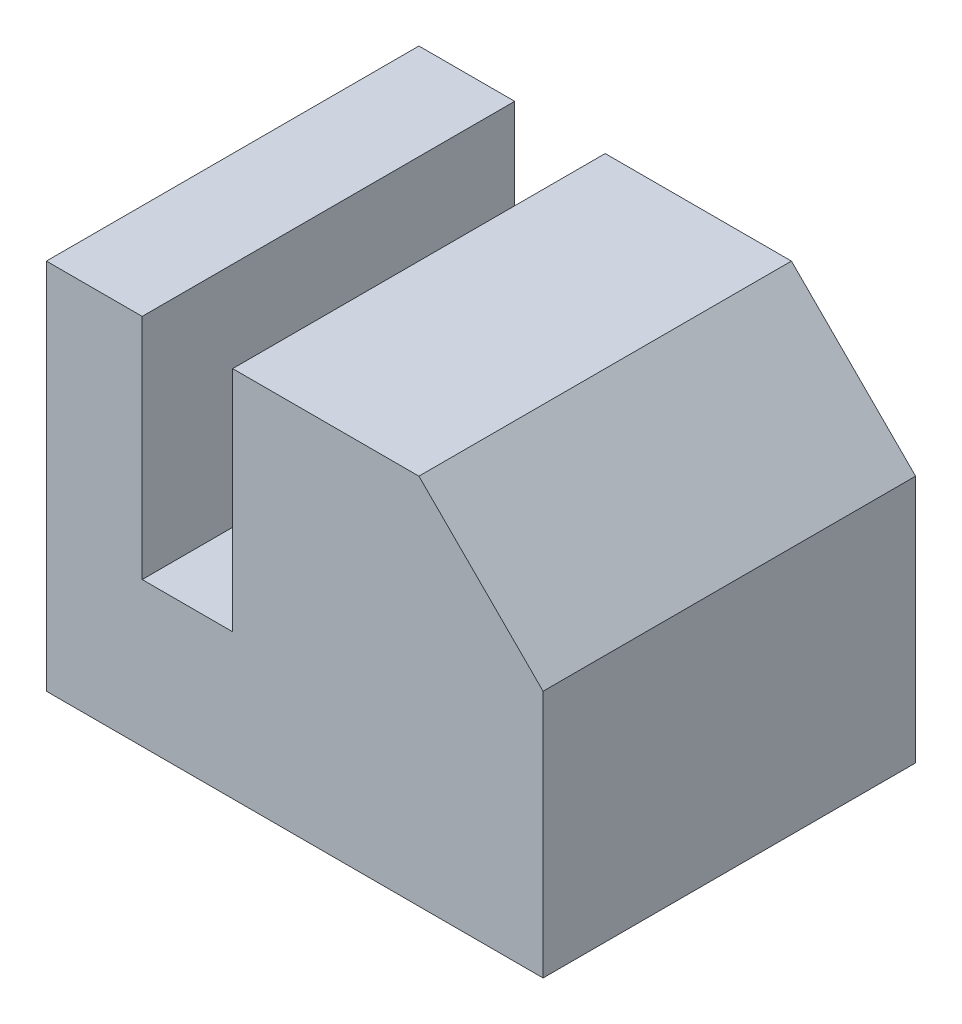
ISO-10303-21;
HEADER;
FILE_DESCRIPTION(('STEP AP214'),'2;1');
FILE_NAME('part.step','',(''),(''),'','','');
FILE_SCHEMA(('AUTOMOTIVE_DESIGN { 1 0 10303 214 1 1 1 1 }'));
ENDSEC;
DATA;
#1=APPLICATION_CONTEXT('core data for automotive mechanical design processes');
#2=APPLICATION_PROTOCOL_DEFINITION('international standard','automotive_design',2000,#1);
#3=PRODUCT_CONTEXT('',#1,'mechanical');
#4=PRODUCT('Part','Part','',(#3));
#5=PRODUCT_RELATED_PRODUCT_CATEGORY('part','',(#4));
#6=PRODUCT_DEFINITION_FORMATION('','',#4);
#7=PRODUCT_DEFINITION_CONTEXT('part definition',#1,'design');
#8=PRODUCT_DEFINITION('design','',#6,#7);
#9=PRODUCT_DEFINITION_SHAPE('','',#8);
#10=(LENGTH_UNIT() NAMED_UNIT(*) SI_UNIT(.MILLI.,.METRE.));
#11=(NAMED_UNIT(*) PLANE_ANGLE_UNIT() SI_UNIT($,.RADIAN.));
#12=(NAMED_UNIT(*) SI_UNIT($,.STERADIAN.) SOLID_ANGLE_UNIT());
#13=UNCERTAINTY_MEASURE_WITH_UNIT(LENGTH_MEASURE(1.E-05),#10,'distance_accuracy_value','');
#14=(GEOMETRIC_REPRESENTATION_CONTEXT(3) GLOBAL_UNCERTAINTY_ASSIGNED_CONTEXT((#13)) GLOBAL_UNIT_ASSIGNED_CONTEXT((#10,
#11,#12)) REPRESENTATION_CONTEXT('',''));
#15=CARTESIAN_POINT('',(0.,0.,0.));
#16=DIRECTION('',(0.,0.,1.));
#17=DIRECTION('',(1.,0.,0.));
#18=AXIS2_PLACEMENT_3D('',#15,#16,#17);
#19=CARTESIAN_POINT('',(-20.,15.,30.));
#20=DIRECTION('',(0.,-1.,0.));
#21=DIRECTION('',(0.,0.,-1.));
#22=AXIS2_PLACEMENT_3D('',#19,#20,#21);
#23=PLANE('',#22);
#24=DIRECTION('',(-1.,0.,0.));
#25=VECTOR('',#24,1.);
#26=CARTESIAN_POINT('',(-20.,15.,30.));
#27=LINE('',#26,#25);
#28=CARTESIAN_POINT('',(-12.2856365778249,15.,30.));
#29=VERTEX_POINT('',#28);
#30=CARTESIAN_POINT('',(-20.,15.,30.));
#31=VERTEX_POINT('',#30);
#32=EDGE_CURVE('E144',#29,#31,#27,.T.);
#33=ORIENTED_EDGE('',*,*,#32,.F.);
#34=DIRECTION('',(0.,0.,1.));
#35=VECTOR('',#34,1.);
#36=CARTESIAN_POINT('',(-12.2856365778249,15.,-19.7472700151907));
#37=LINE('',#36,#35);
#38=CARTESIAN_POINT('',(-12.2856365778249,15.,0.));
#39=VERTEX_POINT('',#38);
#40=EDGE_CURVE('E117',#39,#29,#37,.T.);
#41=ORIENTED_EDGE('',*,*,#40,.F.);
#42=DIRECTION('',(-1.,0.,0.));
#43=VECTOR('',#42,1.);
#44=CARTESIAN_POINT('',(-20.,15.,0.));
#45=LINE('',#44,#43);
#46=CARTESIAN_POINT('',(-20.,15.,0.));
#47=VERTEX_POINT('',#46);
#48=EDGE_CURVE('E155',#39,#47,#45,.T.);
#49=ORIENTED_EDGE('',*,*,#48,.T.);
#50=DIRECTION('',(0.,0.,-1.));
#51=VECTOR('',#50,1.);
#52=CARTESIAN_POINT('',(-20.,15.,30.));
#53=LINE('',#52,#51);
#54=EDGE_CURVE('E41',#31,#47,#53,.T.);
#55=ORIENTED_EDGE('',*,*,#54,.F.);
#56=EDGE_LOOP('',(#33,#41,#49,#55));
#57=FACE_BOUND('',#56,.T.);
#58=ADVANCED_FACE('F33',(#57),#23,.F.);
#59=CARTESIAN_POINT('',(20.,15.,30.));
#60=DIRECTION('',(-1.,0.,0.));
#61=DIRECTION('',(0.,-1.,0.));
#62=AXIS2_PLACEMENT_3D('',#59,#60,#61);
#63=PLANE('',#62);
#64=DIRECTION('',(0.,1.,0.));
#65=VECTOR('',#64,1.);
#66=CARTESIAN_POINT('',(20.,15.,0.));
#67=LINE('',#66,#65);
#68=CARTESIAN_POINT('',(20.,-15.,0.));
#69=VERTEX_POINT('',#68);
#70=CARTESIAN_POINT('',(20.,5.,0.));
#71=VERTEX_POINT('',#70);
#72=EDGE_CURVE('E139',#69,#71,#67,.T.);
#73=ORIENTED_EDGE('',*,*,#72,.T.);
#74=DIRECTION('',(0.,0.,1.));
#75=VECTOR('',#74,1.);
#76=CARTESIAN_POINT('',(20.,5.,-13.));
#77=LINE('',#76,#75);
#78=CARTESIAN_POINT('',(20.,5.,30.));
#79=VERTEX_POINT('',#78);
#80=EDGE_CURVE('E56',#71,#79,#77,.T.);
#81=ORIENTED_EDGE('',*,*,#80,.T.);
#82=DIRECTION('',(0.,1.,0.));
#83=VECTOR('',#82,1.);
#84=CARTESIAN_POINT('',(20.,15.,30.));
#85=LINE('',#84,#83);
#86=CARTESIAN_POINT('',(20.,-15.,30.));
#87=VERTEX_POINT('',#86);
#88=EDGE_CURVE('E141',#87,#79,#85,.T.);
#89=ORIENTED_EDGE('',*,*,#88,.F.);
#90=DIRECTION('',(0.,0.,-1.));
#91=VECTOR('',#90,1.);
#92=CARTESIAN_POINT('',(20.,-15.,30.));
#93=LINE('',#92,#91);
#94=EDGE_CURVE('E152',#87,#69,#93,.T.);
#95=ORIENTED_EDGE('',*,*,#94,.T.);
#96=EDGE_LOOP('',(#73,#81,#89,#95));
#97=FACE_BOUND('',#96,.T.);
#98=ADVANCED_FACE('F35',(#97),#63,.F.);
#99=CARTESIAN_POINT('',(10.,15.,0.));
#100=VERTEX_POINT('',#99);
#101=CARTESIAN_POINT('',(-5.,15.,0.));
#102=VERTEX_POINT('',#101);
#103=EDGE_CURVE('E156',#100,#102,#45,.T.);
#104=ORIENTED_EDGE('',*,*,#103,.T.);
#105=DIRECTION('',(0.,0.,1.));
#106=VECTOR('',#105,1.);
#107=CARTESIAN_POINT('',(-5.,15.,-19.7472700151907));
#108=LINE('',#107,#106);
#109=CARTESIAN_POINT('',(-5.,15.,30.));
#110=VERTEX_POINT('',#109);
#111=EDGE_CURVE('E129',#102,#110,#108,.T.);
#112=ORIENTED_EDGE('',*,*,#111,.T.);
#113=CARTESIAN_POINT('',(10.,15.,30.));
#114=VERTEX_POINT('',#113);
#115=EDGE_CURVE('E146',#114,#110,#27,.T.);
#116=ORIENTED_EDGE('',*,*,#115,.F.);
#117=DIRECTION('',(0.,0.,1.));
#118=VECTOR('',#117,1.);
#119=CARTESIAN_POINT('',(10.,15.,-13.));
#120=LINE('',#119,#118);
#121=EDGE_CURVE('E137',#100,#114,#120,.T.);
#122=ORIENTED_EDGE('',*,*,#121,.F.);
#123=EDGE_LOOP('',(#104,#112,#116,#122));
#124=FACE_BOUND('',#123,.T.);
#125=ADVANCED_FACE('F188',(#124),#23,.F.);
#126=CARTESIAN_POINT('',(-20.,15.,30.));
#127=DIRECTION('',(1.,0.,0.));
#128=DIRECTION('',(0.,0.,-1.));
#129=AXIS2_PLACEMENT_3D('',#126,#127,#128);
#130=PLANE('',#129);
#131=DIRECTION('',(0.,-1.,0.));
#132=VECTOR('',#131,1.);
#133=CARTESIAN_POINT('',(-20.,15.,0.));
#134=LINE('',#133,#132);
#135=CARTESIAN_POINT('',(-20.,-15.,0.));
#136=VERTEX_POINT('',#135);
#137=EDGE_CURVE('E159',#47,#136,#134,.T.);
#138=ORIENTED_EDGE('',*,*,#137,.T.);
#139=DIRECTION('',(0.,0.,-1.));
#140=VECTOR('',#139,1.);
#141=CARTESIAN_POINT('',(-20.,-15.,30.));
#142=LINE('',#141,#140);
#143=CARTESIAN_POINT('',(-20.,-15.,30.));
#144=VERTEX_POINT('',#143);
#145=EDGE_CURVE('E164',#144,#136,#142,.T.);
#146=ORIENTED_EDGE('',*,*,#145,.F.);
#147=DIRECTION('',(0.,-1.,0.));
#148=VECTOR('',#147,1.);
#149=CARTESIAN_POINT('',(-20.,15.,30.));
#150=LINE('',#149,#148);
#151=EDGE_CURVE('E148',#31,#144,#150,.T.);
#152=ORIENTED_EDGE('',*,*,#151,.F.);
#153=ORIENTED_EDGE('',*,*,#54,.T.);
#154=EDGE_LOOP('',(#138,#146,#152,#153));
#155=FACE_BOUND('',#154,.T.);
#156=ADVANCED_FACE('F171',(#155),#130,.F.);
#157=CARTESIAN_POINT('',(-20.,-15.,30.));
#158=DIRECTION('',(0.,1.,0.));
#159=DIRECTION('',(0.,0.,1.));
#160=AXIS2_PLACEMENT_3D('',#157,#158,#159);
#161=PLANE('',#160);
#162=DIRECTION('',(1.,0.,0.));
#163=VECTOR('',#162,1.);
#164=CARTESIAN_POINT('',(-20.,-15.,0.));
#165=LINE('',#164,#163);
#166=EDGE_CURVE('E145',#136,#69,#165,.T.);
#167=ORIENTED_EDGE('',*,*,#166,.T.);
#168=ORIENTED_EDGE('',*,*,#94,.F.);
#169=DIRECTION('',(1.,0.,0.));
#170=VECTOR('',#169,1.);
#171=CARTESIAN_POINT('',(-20.,-15.,30.));
#172=LINE('',#171,#170);
#173=EDGE_CURVE('E150',#144,#87,#172,.T.);
#174=ORIENTED_EDGE('',*,*,#173,.F.);
#175=ORIENTED_EDGE('',*,*,#145,.T.);
#176=EDGE_LOOP('',(#167,#168,#174,#175));
#177=FACE_BOUND('',#176,.T.);
#178=ADVANCED_FACE('F181',(#177),#161,.F.);
#179=CARTESIAN_POINT('',(0.,0.,30.));
#180=DIRECTION('',(0.,0.,1.));
#181=DIRECTION('',(1.,0.,0.));
#182=AXIS2_PLACEMENT_3D('',#179,#180,#181);
#183=PLANE('',#182);
#184=DIRECTION('',(0.,-1.,0.));
#185=VECTOR('',#184,1.);
#186=CARTESIAN_POINT('',(-12.2856365778249,15.,30.));
#187=LINE('',#186,#185);
#188=CARTESIAN_POINT('',(-12.2856365778249,-3.35413230606962,30.));
#189=VERTEX_POINT('',#188);
#190=EDGE_CURVE('E114',#29,#189,#187,.T.);
#191=ORIENTED_EDGE('',*,*,#190,.F.);
#192=ORIENTED_EDGE('',*,*,#32,.T.);
#193=ORIENTED_EDGE('',*,*,#151,.T.);
#194=ORIENTED_EDGE('',*,*,#173,.T.);
#195=ORIENTED_EDGE('',*,*,#88,.T.);
#196=DIRECTION('',(0.707106781186547,-0.707106781186548,0.));
#197=VECTOR('',#196,1.);
#198=CARTESIAN_POINT('',(10.,15.,30.));
#199=LINE('',#198,#197);
#200=EDGE_CURVE('E134',#114,#79,#199,.T.);
#201=ORIENTED_EDGE('',*,*,#200,.F.);
#202=ORIENTED_EDGE('',*,*,#115,.T.);
#203=DIRECTION('',(0.,1.,0.));
#204=VECTOR('',#203,1.);
#205=CARTESIAN_POINT('',(-5.,15.,30.));
#206=LINE('',#205,#204);
#207=CARTESIAN_POINT('',(-5.,-3.35413230606962,30.));
#208=VERTEX_POINT('',#207);
#209=EDGE_CURVE('E111',#208,#110,#206,.T.);
#210=ORIENTED_EDGE('',*,*,#209,.F.);
#211=DIRECTION('',(1.,0.,0.));
#212=VECTOR('',#211,1.);
#213=CARTESIAN_POINT('',(-12.2856365778249,-3.35413230606962,30.));
#214=LINE('',#213,#212);
#215=EDGE_CURVE('E105',#189,#208,#214,.T.);
#216=ORIENTED_EDGE('',*,*,#215,.F.);
#217=EDGE_LOOP('',(#191,#192,#193,#194,#195,#201,#202,#210,#216));
#218=FACE_BOUND('',#217,.T.);
#219=ADVANCED_FACE('F121',(#218),#183,.T.);
#220=CARTESIAN_POINT('',(0.,0.,0.));
#221=DIRECTION('',(0.,0.,1.));
#222=DIRECTION('',(1.,0.,0.));
#223=AXIS2_PLACEMENT_3D('',#220,#221,#222);
#224=PLANE('',#223);
#225=ORIENTED_EDGE('',*,*,#48,.F.);
#226=DIRECTION('',(0.,1.,0.));
#227=VECTOR('',#226,1.);
#228=CARTESIAN_POINT('',(-12.2856365778249,15.,0.));
#229=LINE('',#228,#227);
#230=CARTESIAN_POINT('',(-12.2856365778249,-3.35413230606962,0.));
#231=VERTEX_POINT('',#230);
#232=EDGE_CURVE('E135',#231,#39,#229,.T.);
#233=ORIENTED_EDGE('',*,*,#232,.F.);
#234=DIRECTION('',(-1.,0.,0.));
#235=VECTOR('',#234,1.);
#236=CARTESIAN_POINT('',(-12.2856365778249,-3.35413230606962,0.));
#237=LINE('',#236,#235);
#238=CARTESIAN_POINT('',(-5.,-3.35413230606962,0.));
#239=VERTEX_POINT('',#238);
#240=EDGE_CURVE('E108',#239,#231,#237,.T.);
#241=ORIENTED_EDGE('',*,*,#240,.F.);
#242=DIRECTION('',(0.,-1.,0.));
#243=VECTOR('',#242,1.);
#244=CARTESIAN_POINT('',(-5.,15.,0.));
#245=LINE('',#244,#243);
#246=EDGE_CURVE('E128',#102,#239,#245,.T.);
#247=ORIENTED_EDGE('',*,*,#246,.F.);
#248=ORIENTED_EDGE('',*,*,#103,.F.);
#249=DIRECTION('',(0.707106781186547,-0.707106781186548,0.));
#250=VECTOR('',#249,1.);
#251=CARTESIAN_POINT('',(12.5,12.5,0.));
#252=LINE('',#251,#250);
#253=EDGE_CURVE('E11',#100,#71,#252,.T.);
#254=ORIENTED_EDGE('',*,*,#253,.T.);
#255=ORIENTED_EDGE('',*,*,#72,.F.);
#256=ORIENTED_EDGE('',*,*,#166,.F.);
#257=ORIENTED_EDGE('',*,*,#137,.F.);
#258=EDGE_LOOP('',(#225,#233,#241,#247,#248,#254,#255,#256,#257));
#259=FACE_BOUND('',#258,.T.);
#260=ADVANCED_FACE('F177',(#259),#224,.F.);
#261=CARTESIAN_POINT('',(10.,15.,-13.));
#262=DIRECTION('',(-0.707106781186548,-0.707106781186547,0.));
#263=DIRECTION('',(0.707106781186547,-0.707106781186548,0.));
#264=AXIS2_PLACEMENT_3D('',#261,#262,#263);
#265=PLANE('',#264);
#266=ORIENTED_EDGE('',*,*,#121,.T.);
#267=ORIENTED_EDGE('',*,*,#200,.T.);
#268=ORIENTED_EDGE('',*,*,#80,.F.);
#269=ORIENTED_EDGE('',*,*,#253,.F.);
#270=EDGE_LOOP('',(#266,#267,#268,#269));
#271=FACE_BOUND('',#270,.T.);
#272=ADVANCED_FACE('F211',(#271),#265,.F.);
#273=CARTESIAN_POINT('',(-12.2856365778249,15.,-19.7472700151907));
#274=DIRECTION('',(-1.,0.,0.));
#275=DIRECTION('',(0.,0.,1.));
#276=AXIS2_PLACEMENT_3D('',#273,#274,#275);
#277=PLANE('',#276);
#278=ORIENTED_EDGE('',*,*,#232,.T.);
#279=ORIENTED_EDGE('',*,*,#40,.T.);
#280=ORIENTED_EDGE('',*,*,#190,.T.);
#281=DIRECTION('',(0.,0.,1.));
#282=VECTOR('',#281,1.);
#283=CARTESIAN_POINT('',(-12.2856365778249,-3.35413230606962,-19.7472700151907));
#284=LINE('',#283,#282);
#285=EDGE_CURVE('E101',#231,#189,#284,.T.);
#286=ORIENTED_EDGE('',*,*,#285,.F.);
#287=EDGE_LOOP('',(#278,#279,#280,#286));
#288=FACE_BOUND('',#287,.T.);
#289=ADVANCED_FACE('F115',(#288),#277,.F.);
#290=CARTESIAN_POINT('',(-5.,15.,-19.7472700151907));
#291=DIRECTION('',(1.,0.,0.));
#292=DIRECTION('',(0.,0.,-1.));
#293=AXIS2_PLACEMENT_3D('',#290,#291,#292);
#294=PLANE('',#293);
#295=ORIENTED_EDGE('',*,*,#246,.T.);
#296=DIRECTION('',(0.,0.,1.));
#297=VECTOR('',#296,1.);
#298=CARTESIAN_POINT('',(-5.,-3.35413230606962,-19.7472700151907));
#299=LINE('',#298,#297);
#300=EDGE_CURVE('E48',#239,#208,#299,.T.);
#301=ORIENTED_EDGE('',*,*,#300,.T.);
#302=ORIENTED_EDGE('',*,*,#209,.T.);
#303=ORIENTED_EDGE('',*,*,#111,.F.);
#304=EDGE_LOOP('',(#295,#301,#302,#303));
#305=FACE_BOUND('',#304,.T.);
#306=ADVANCED_FACE('F203',(#305),#294,.F.);
#307=CARTESIAN_POINT('',(-12.2856365778249,-3.35413230606962,-19.7472700151907));
#308=DIRECTION('',(0.,-1.,0.));
#309=DIRECTION('',(0.,0.,-1.));
#310=AXIS2_PLACEMENT_3D('',#307,#308,#309);
#311=PLANE('',#310);
#312=ORIENTED_EDGE('',*,*,#240,.T.);
#313=ORIENTED_EDGE('',*,*,#285,.T.);
#314=ORIENTED_EDGE('',*,*,#215,.T.);
#315=ORIENTED_EDGE('',*,*,#300,.F.);
#316=EDGE_LOOP('',(#312,#313,#314,#315));
#317=FACE_BOUND('',#316,.T.);
#318=ADVANCED_FACE('F103',(#317),#311,.F.);
#319=CLOSED_SHELL('',(#58,#98,#125,#156,#178,#219,#260,#272,#289,#306,#318));
#320=MANIFOLD_SOLID_BREP('B2',#319);
#321=ADVANCED_BREP_SHAPE_REPRESENTATION('',(#18,#320),#14);
#322=SHAPE_DEFINITION_REPRESENTATION(#9,#321);
ENDSEC;
END-ISO-10303-21;
